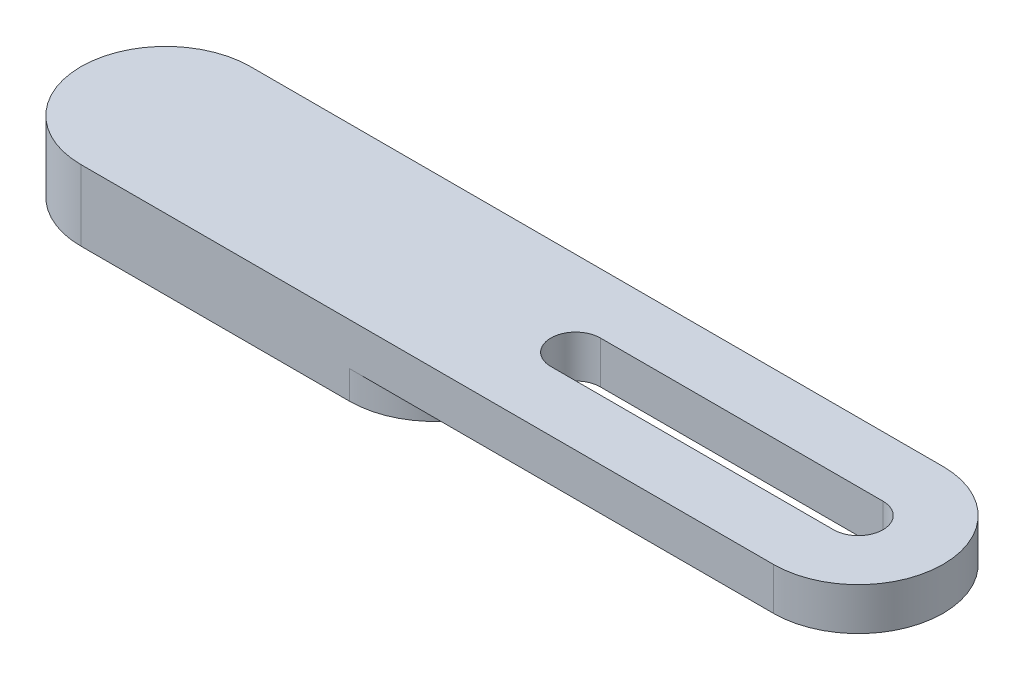
ISO-10303-21;
HEADER;
FILE_DESCRIPTION(('STEP AP214'),'2;1');
FILE_NAME('part.step','',(''),(''),'','','');
FILE_SCHEMA(('AUTOMOTIVE_DESIGN { 1 0 10303 214 1 1 1 1 }'));
ENDSEC;
DATA;
#1=APPLICATION_CONTEXT('core data for automotive mechanical design processes');
#2=APPLICATION_PROTOCOL_DEFINITION('international standard','automotive_design',2000,#1);
#3=PRODUCT_CONTEXT('',#1,'mechanical');
#4=PRODUCT('Part','Part','',(#3));
#5=PRODUCT_RELATED_PRODUCT_CATEGORY('part','',(#4));
#6=PRODUCT_DEFINITION_FORMATION('','',#4);
#7=PRODUCT_DEFINITION_CONTEXT('part definition',#1,'design');
#8=PRODUCT_DEFINITION('design','',#6,#7);
#9=PRODUCT_DEFINITION_SHAPE('','',#8);
#10=(LENGTH_UNIT() NAMED_UNIT(*) SI_UNIT(.MILLI.,.METRE.));
#11=(NAMED_UNIT(*) PLANE_ANGLE_UNIT() SI_UNIT($,.RADIAN.));
#12=(NAMED_UNIT(*) SI_UNIT($,.STERADIAN.) SOLID_ANGLE_UNIT());
#13=UNCERTAINTY_MEASURE_WITH_UNIT(LENGTH_MEASURE(1.E-05),#10,'distance_accuracy_value','');
#14=(GEOMETRIC_REPRESENTATION_CONTEXT(3) GLOBAL_UNCERTAINTY_ASSIGNED_CONTEXT((#13)) GLOBAL_UNIT_ASSIGNED_CONTEXT((#10,
#11,#12)) REPRESENTATION_CONTEXT('',''));
#15=CARTESIAN_POINT('',(0.,0.,0.));
#16=DIRECTION('',(0.,0.,1.));
#17=DIRECTION('',(1.,0.,0.));
#18=AXIS2_PLACEMENT_3D('',#15,#16,#17);
#19=CARTESIAN_POINT('',(19.,-3.,0.));
#20=DIRECTION('',(0.,1.,0.));
#21=DIRECTION('',(0.,0.,1.));
#22=AXIS2_PLACEMENT_3D('',#19,#20,#21);
#23=CYLINDRICAL_SURFACE('',#22,6.);
#24=DIRECTION('',(0.,1.,0.));
#25=VECTOR('',#24,1.);
#26=CARTESIAN_POINT('',(19.,-3.,-6.));
#27=LINE('',#26,#25);
#28=CARTESIAN_POINT('',(19.,-3.,-6.));
#29=VERTEX_POINT('',#28);
#30=CARTESIAN_POINT('',(19.,-1.,-6.));
#31=VERTEX_POINT('',#30);
#32=EDGE_CURVE('E144',#29,#31,#27,.T.);
#33=ORIENTED_EDGE('',*,*,#32,.T.);
#34=CARTESIAN_POINT('',(19.,-1.,0.));
#35=DIRECTION('',(0.,1.,0.));
#36=DIRECTION('',(0.,0.,1.));
#37=AXIS2_PLACEMENT_3D('',#34,#35,#36);
#38=CIRCLE('',#37,6.);
#39=CARTESIAN_POINT('',(19.,-1.,6.));
#40=VERTEX_POINT('',#39);
#41=EDGE_CURVE('E502',#40,#31,#38,.T.);
#42=ORIENTED_EDGE('',*,*,#41,.F.);
#43=DIRECTION('',(0.,1.,0.));
#44=VECTOR('',#43,1.);
#45=CARTESIAN_POINT('',(19.,-3.,6.));
#46=LINE('',#45,#44);
#47=CARTESIAN_POINT('',(19.,-3.,6.));
#48=VERTEX_POINT('',#47);
#49=EDGE_CURVE('E47',#48,#40,#46,.T.);
#50=ORIENTED_EDGE('',*,*,#49,.F.);
#51=CARTESIAN_POINT('',(19.,-3.,0.));
#52=DIRECTION('',(0.,1.,0.));
#53=DIRECTION('',(0.,0.,1.));
#54=AXIS2_PLACEMENT_3D('',#51,#52,#53);
#55=CIRCLE('',#54,6.);
#56=EDGE_CURVE('E545',#48,#29,#55,.T.);
#57=ORIENTED_EDGE('',*,*,#56,.T.);
#58=EDGE_LOOP('',(#33,#42,#50,#57));
#59=FACE_BOUND('',#58,.T.);
#60=ADVANCED_FACE('F43',(#59),#23,.T.);
#61=CARTESIAN_POINT('',(19.,-3.,0.));
#62=DIRECTION('',(0.,1.,0.));
#63=DIRECTION('',(0.,0.,1.));
#64=AXIS2_PLACEMENT_3D('',#61,#62,#63);
#65=CYLINDRICAL_SURFACE('',#64,2.5);
#66=CARTESIAN_POINT('',(19.,0.,0.));
#67=DIRECTION('',(0.,1.,0.));
#68=DIRECTION('',(0.,0.,1.));
#69=AXIS2_PLACEMENT_3D('',#66,#67,#68);
#70=CIRCLE('',#69,2.5);
#71=CARTESIAN_POINT('',(19.1973684210526,0.,2.49219696379945));
#72=VERTEX_POINT('',#71);
#73=CARTESIAN_POINT('',(19.1973684210526,0.,-2.49219696379945));
#74=VERTEX_POINT('',#73);
#75=EDGE_CURVE('E126',#72,#74,#70,.T.);
#76=ORIENTED_EDGE('',*,*,#75,.T.);
#77=DIRECTION('',(0.,1.,0.));
#78=VECTOR('',#77,1.);
#79=CARTESIAN_POINT('',(19.1973684210526,-3.,-2.49219696379945));
#80=LINE('',#79,#78);
#81=CARTESIAN_POINT('',(19.1973684210526,-3.,-2.49219696379945));
#82=VERTEX_POINT('',#81);
#83=EDGE_CURVE('E11',#82,#74,#80,.T.);
#84=ORIENTED_EDGE('',*,*,#83,.F.);
#85=CARTESIAN_POINT('',(19.,-3.,0.));
#86=DIRECTION('',(0.,1.,0.));
#87=DIRECTION('',(0.,0.,1.));
#88=AXIS2_PLACEMENT_3D('',#85,#86,#87);
#89=CIRCLE('',#88,2.5);
#90=CARTESIAN_POINT('',(19.1973684210526,-3.,2.49219696379945));
#91=VERTEX_POINT('',#90);
#92=EDGE_CURVE('E62',#91,#82,#89,.T.);
#93=ORIENTED_EDGE('',*,*,#92,.F.);
#94=DIRECTION('',(0.,1.,0.));
#95=VECTOR('',#94,1.);
#96=CARTESIAN_POINT('',(19.1973684210526,-3.,2.49219696379945));
#97=LINE('',#96,#95);
#98=EDGE_CURVE('E117',#91,#72,#97,.T.);
#99=ORIENTED_EDGE('',*,*,#98,.T.);
#100=EDGE_LOOP('',(#76,#84,#93,#99));
#101=FACE_BOUND('',#100,.T.);
#102=ADVANCED_FACE('F193',(#101),#65,.F.);
#103=CARTESIAN_POINT('',(0.31578947368421,-3.,-3.98751514207912));
#104=DIRECTION('',(-0.0789473684210526,0.,0.996878785519779));
#105=DIRECTION('',(0.99687878551978,0.,0.0789473684210526));
#106=AXIS2_PLACEMENT_3D('',#103,#104,#105);
#107=PLANE('',#106);
#108=DIRECTION('',(0.99687878551978,0.,0.0789473684210526));
#109=VECTOR('',#108,1.);
#110=CARTESIAN_POINT('',(0.31578947368421,0.,-3.98751514207912));
#111=LINE('',#110,#109);
#112=CARTESIAN_POINT('',(0.31578947368421,0.,-3.98751514207912));
#113=VERTEX_POINT('',#112);
#114=EDGE_CURVE('E133',#113,#74,#111,.T.);
#115=ORIENTED_EDGE('',*,*,#114,.F.);
#116=DIRECTION('',(0.,1.,0.));
#117=VECTOR('',#116,1.);
#118=CARTESIAN_POINT('',(0.31578947368421,-3.,-3.98751514207912));
#119=LINE('',#118,#117);
#120=CARTESIAN_POINT('',(0.31578947368421,-3.,-3.98751514207912));
#121=VERTEX_POINT('',#120);
#122=EDGE_CURVE('E53',#121,#113,#119,.T.);
#123=ORIENTED_EDGE('',*,*,#122,.F.);
#124=DIRECTION('',(0.99687878551978,0.,0.0789473684210526));
#125=VECTOR('',#124,1.);
#126=CARTESIAN_POINT('',(0.31578947368421,-3.,-3.98751514207912));
#127=LINE('',#126,#125);
#128=EDGE_CURVE('E111',#121,#82,#127,.T.);
#129=ORIENTED_EDGE('',*,*,#128,.T.);
#130=ORIENTED_EDGE('',*,*,#83,.T.);
#131=EDGE_LOOP('',(#115,#123,#129,#130));
#132=FACE_BOUND('',#131,.T.);
#133=ADVANCED_FACE('F196',(#132),#107,.T.);
#134=CARTESIAN_POINT('',(0.,-3.,0.));
#135=DIRECTION('',(0.,1.,0.));
#136=DIRECTION('',(0.,0.,1.));
#137=AXIS2_PLACEMENT_3D('',#134,#135,#136);
#138=CYLINDRICAL_SURFACE('',#137,4.);
#139=CARTESIAN_POINT('',(0.,0.,0.));
#140=DIRECTION('',(0.,1.,0.));
#141=DIRECTION('',(0.,0.,1.));
#142=AXIS2_PLACEMENT_3D('',#139,#140,#141);
#143=CIRCLE('',#142,4.);
#144=CARTESIAN_POINT('',(0.31578947368421,0.,3.98751514207912));
#145=VERTEX_POINT('',#144);
#146=EDGE_CURVE('E115',#113,#145,#143,.T.);
#147=ORIENTED_EDGE('',*,*,#146,.T.);
#148=DIRECTION('',(0.,1.,0.));
#149=VECTOR('',#148,1.);
#150=CARTESIAN_POINT('',(0.31578947368421,-3.,3.98751514207912));
#151=LINE('',#150,#149);
#152=CARTESIAN_POINT('',(0.31578947368421,-3.,3.98751514207912));
#153=VERTEX_POINT('',#152);
#154=EDGE_CURVE('E78',#153,#145,#151,.T.);
#155=ORIENTED_EDGE('',*,*,#154,.F.);
#156=CARTESIAN_POINT('',(0.,-3.,0.));
#157=DIRECTION('',(0.,1.,0.));
#158=DIRECTION('',(0.,0.,1.));
#159=AXIS2_PLACEMENT_3D('',#156,#157,#158);
#160=CIRCLE('',#159,4.);
#161=EDGE_CURVE('E107',#121,#153,#160,.T.);
#162=ORIENTED_EDGE('',*,*,#161,.F.);
#163=ORIENTED_EDGE('',*,*,#122,.T.);
#164=EDGE_LOOP('',(#147,#155,#162,#163));
#165=FACE_BOUND('',#164,.T.);
#166=ADVANCED_FACE('F113',(#165),#138,.F.);
#167=CARTESIAN_POINT('',(0.,-3.,6.));
#168=DIRECTION('',(0.,0.,1.));
#169=DIRECTION('',(1.,0.,0.));
#170=AXIS2_PLACEMENT_3D('',#167,#168,#169);
#171=PLANE('',#170);
#172=ORIENTED_EDGE('',*,*,#49,.T.);
#173=DIRECTION('',(-1.,0.,0.));
#174=VECTOR('',#173,1.);
#175=CARTESIAN_POINT('',(0.,-1.,6.));
#176=LINE('',#175,#174);
#177=CARTESIAN_POINT('',(49.,-1.,6.));
#178=VERTEX_POINT('',#177);
#179=EDGE_CURVE('E154',#178,#40,#176,.T.);
#180=ORIENTED_EDGE('',*,*,#179,.F.);
#181=DIRECTION('',(0.,1.,0.));
#182=VECTOR('',#181,1.);
#183=CARTESIAN_POINT('',(49.,-1.,6.));
#184=LINE('',#183,#182);
#185=CARTESIAN_POINT('',(49.,2.,6.));
#186=VERTEX_POINT('',#185);
#187=EDGE_CURVE('E525',#178,#186,#184,.T.);
#188=ORIENTED_EDGE('',*,*,#187,.T.);
#189=DIRECTION('',(1.,0.,0.));
#190=VECTOR('',#189,1.);
#191=CARTESIAN_POINT('',(0.,2.,6.));
#192=LINE('',#191,#190);
#193=CARTESIAN_POINT('',(0.,2.,6.));
#194=VERTEX_POINT('',#193);
#195=EDGE_CURVE('E527',#194,#186,#192,.T.);
#196=ORIENTED_EDGE('',*,*,#195,.F.);
#197=DIRECTION('',(0.,1.,0.));
#198=VECTOR('',#197,1.);
#199=CARTESIAN_POINT('',(0.,-3.,6.));
#200=LINE('',#199,#198);
#201=CARTESIAN_POINT('',(0.,-3.,6.));
#202=VERTEX_POINT('',#201);
#203=EDGE_CURVE('E139',#202,#194,#200,.T.);
#204=ORIENTED_EDGE('',*,*,#203,.F.);
#205=DIRECTION('',(1.,0.,0.));
#206=VECTOR('',#205,1.);
#207=CARTESIAN_POINT('',(0.,-3.,6.));
#208=LINE('',#207,#206);
#209=EDGE_CURVE('E135',#202,#48,#208,.T.);
#210=ORIENTED_EDGE('',*,*,#209,.T.);
#211=EDGE_LOOP('',(#172,#180,#188,#196,#204,#210));
#212=FACE_BOUND('',#211,.T.);
#213=ADVANCED_FACE('F45',(#212),#171,.T.);
#214=CARTESIAN_POINT('',(0.,-3.,0.));
#215=DIRECTION('',(0.,1.,0.));
#216=DIRECTION('',(0.,0.,1.));
#217=AXIS2_PLACEMENT_3D('',#214,#215,#216);
#218=CYLINDRICAL_SURFACE('',#217,6.);
#219=ORIENTED_EDGE('',*,*,#203,.T.);
#220=CARTESIAN_POINT('',(0.,2.,0.));
#221=DIRECTION('',(0.,1.,0.));
#222=DIRECTION('',(0.,0.,1.));
#223=AXIS2_PLACEMENT_3D('',#220,#221,#222);
#224=CIRCLE('',#223,6.);
#225=CARTESIAN_POINT('',(0.,2.,-6.));
#226=VERTEX_POINT('',#225);
#227=EDGE_CURVE('E130',#226,#194,#224,.T.);
#228=ORIENTED_EDGE('',*,*,#227,.F.);
#229=DIRECTION('',(0.,1.,0.));
#230=VECTOR('',#229,1.);
#231=CARTESIAN_POINT('',(0.,-3.,-6.));
#232=LINE('',#231,#230);
#233=CARTESIAN_POINT('',(0.,-3.,-6.));
#234=VERTEX_POINT('',#233);
#235=EDGE_CURVE('E142',#234,#226,#232,.T.);
#236=ORIENTED_EDGE('',*,*,#235,.F.);
#237=CARTESIAN_POINT('',(0.,-3.,0.));
#238=DIRECTION('',(0.,1.,0.));
#239=DIRECTION('',(0.,0.,1.));
#240=AXIS2_PLACEMENT_3D('',#237,#238,#239);
#241=CIRCLE('',#240,6.);
#242=EDGE_CURVE('E121',#234,#202,#241,.T.);
#243=ORIENTED_EDGE('',*,*,#242,.T.);
#244=EDGE_LOOP('',(#219,#228,#236,#243));
#245=FACE_BOUND('',#244,.T.);
#246=ADVANCED_FACE('F222',(#245),#218,.T.);
#247=CARTESIAN_POINT('',(0.,-3.,-6.));
#248=DIRECTION('',(0.,0.,-1.));
#249=DIRECTION('',(-1.,0.,0.));
#250=AXIS2_PLACEMENT_3D('',#247,#248,#249);
#251=PLANE('',#250);
#252=ORIENTED_EDGE('',*,*,#235,.T.);
#253=DIRECTION('',(-1.,0.,0.));
#254=VECTOR('',#253,1.);
#255=CARTESIAN_POINT('',(0.,2.,-6.));
#256=LINE('',#255,#254);
#257=CARTESIAN_POINT('',(49.,2.,-6.));
#258=VERTEX_POINT('',#257);
#259=EDGE_CURVE('E540',#258,#226,#256,.T.);
#260=ORIENTED_EDGE('',*,*,#259,.F.);
#261=DIRECTION('',(0.,1.,0.));
#262=VECTOR('',#261,1.);
#263=CARTESIAN_POINT('',(49.,-1.,-6.));
#264=LINE('',#263,#262);
#265=CARTESIAN_POINT('',(49.,-1.,-6.));
#266=VERTEX_POINT('',#265);
#267=EDGE_CURVE('E528',#266,#258,#264,.T.);
#268=ORIENTED_EDGE('',*,*,#267,.F.);
#269=DIRECTION('',(-1.,0.,0.));
#270=VECTOR('',#269,1.);
#271=CARTESIAN_POINT('',(0.,-1.,-6.));
#272=LINE('',#271,#270);
#273=EDGE_CURVE('E498',#266,#31,#272,.T.);
#274=ORIENTED_EDGE('',*,*,#273,.T.);
#275=ORIENTED_EDGE('',*,*,#32,.F.);
#276=DIRECTION('',(-1.,0.,0.));
#277=VECTOR('',#276,1.);
#278=CARTESIAN_POINT('',(0.,-3.,-6.));
#279=LINE('',#278,#277);
#280=EDGE_CURVE('E547',#29,#234,#279,.T.);
#281=ORIENTED_EDGE('',*,*,#280,.T.);
#282=EDGE_LOOP('',(#252,#260,#268,#274,#275,#281));
#283=FACE_BOUND('',#282,.T.);
#284=ADVANCED_FACE('F219',(#283),#251,.T.);
#285=CARTESIAN_POINT('',(0.31578947368421,-3.,3.98751514207912));
#286=DIRECTION('',(-0.0789473684210526,0.,-0.996878785519779));
#287=DIRECTION('',(-0.99687878551978,0.,0.0789473684210526));
#288=AXIS2_PLACEMENT_3D('',#285,#286,#287);
#289=PLANE('',#288);
#290=DIRECTION('',(-0.99687878551978,0.,0.0789473684210526));
#291=VECTOR('',#290,1.);
#292=CARTESIAN_POINT('',(0.31578947368421,0.,3.98751514207912));
#293=LINE('',#292,#291);
#294=EDGE_CURVE('E129',#72,#145,#293,.T.);
#295=ORIENTED_EDGE('',*,*,#294,.F.);
#296=ORIENTED_EDGE('',*,*,#98,.F.);
#297=DIRECTION('',(-0.99687878551978,0.,0.0789473684210526));
#298=VECTOR('',#297,1.);
#299=CARTESIAN_POINT('',(0.31578947368421,-3.,3.98751514207912));
#300=LINE('',#299,#298);
#301=EDGE_CURVE('E109',#91,#153,#300,.T.);
#302=ORIENTED_EDGE('',*,*,#301,.T.);
#303=ORIENTED_EDGE('',*,*,#154,.T.);
#304=EDGE_LOOP('',(#295,#296,#302,#303));
#305=FACE_BOUND('',#304,.T.);
#306=ADVANCED_FACE('F119',(#305),#289,.T.);
#307=CARTESIAN_POINT('',(0.,-3.,0.));
#308=DIRECTION('',(0.,1.,0.));
#309=DIRECTION('',(0.,0.,1.));
#310=AXIS2_PLACEMENT_3D('',#307,#308,#309);
#311=PLANE('',#310);
#312=ORIENTED_EDGE('',*,*,#209,.F.);
#313=ORIENTED_EDGE('',*,*,#242,.F.);
#314=ORIENTED_EDGE('',*,*,#280,.F.);
#315=ORIENTED_EDGE('',*,*,#56,.F.);
#316=EDGE_LOOP('',(#312,#313,#314,#315));
#317=FACE_BOUND('',#316,.T.);
#318=ORIENTED_EDGE('',*,*,#92,.T.);
#319=ORIENTED_EDGE('',*,*,#128,.F.);
#320=ORIENTED_EDGE('',*,*,#161,.T.);
#321=ORIENTED_EDGE('',*,*,#301,.F.);
#322=EDGE_LOOP('',(#318,#319,#320,#321));
#323=FACE_BOUND('',#322,.T.);
#324=ADVANCED_FACE('F108',(#317,#323),#311,.F.);
#325=CARTESIAN_POINT('',(0.,0.,0.));
#326=DIRECTION('',(0.,1.,0.));
#327=DIRECTION('',(0.,0.,1.));
#328=AXIS2_PLACEMENT_3D('',#325,#326,#327);
#329=PLANE('',#328);
#330=ORIENTED_EDGE('',*,*,#75,.F.);
#331=ORIENTED_EDGE('',*,*,#294,.T.);
#332=ORIENTED_EDGE('',*,*,#146,.F.);
#333=ORIENTED_EDGE('',*,*,#114,.T.);
#334=EDGE_LOOP('',(#330,#331,#332,#333));
#335=FACE_BOUND('',#334,.T.);
#336=ADVANCED_FACE('F197',(#335),#329,.F.);
#337=CARTESIAN_POINT('',(0.,2.,0.));
#338=DIRECTION('',(0.,1.,0.));
#339=DIRECTION('',(0.,0.,1.));
#340=AXIS2_PLACEMENT_3D('',#337,#338,#339);
#341=PLANE('',#340);
#342=ORIENTED_EDGE('',*,*,#195,.T.);
#343=CARTESIAN_POINT('',(49.,2.,0.));
#344=DIRECTION('',(0.,1.,0.));
#345=DIRECTION('',(0.,0.,1.));
#346=AXIS2_PLACEMENT_3D('',#343,#344,#345);
#347=CIRCLE('',#346,6.);
#348=EDGE_CURVE('E522',#186,#258,#347,.T.);
#349=ORIENTED_EDGE('',*,*,#348,.T.);
#350=ORIENTED_EDGE('',*,*,#259,.T.);
#351=ORIENTED_EDGE('',*,*,#227,.T.);
#352=EDGE_LOOP('',(#342,#349,#350,#351));
#353=FACE_BOUND('',#352,.T.);
#354=DIRECTION('',(-1.,0.,0.));
#355=VECTOR('',#354,1.);
#356=CARTESIAN_POINT('',(0.,2.,-1.74999999999999));
#357=LINE('',#356,#355);
#358=CARTESIAN_POINT('',(49.,2.,-1.75));
#359=VERTEX_POINT('',#358);
#360=CARTESIAN_POINT('',(29.,2.,-1.75));
#361=VERTEX_POINT('',#360);
#362=EDGE_CURVE('E511',#359,#361,#357,.T.);
#363=ORIENTED_EDGE('',*,*,#362,.F.);
#364=CARTESIAN_POINT('',(49.,2.,0.));
#365=DIRECTION('',(0.,1.,0.));
#366=DIRECTION('',(0.,0.,1.));
#367=AXIS2_PLACEMENT_3D('',#364,#365,#366);
#368=CIRCLE('',#367,1.75);
#369=CARTESIAN_POINT('',(49.,2.,1.75));
#370=VERTEX_POINT('',#369);
#371=EDGE_CURVE('E514',#370,#359,#368,.T.);
#372=ORIENTED_EDGE('',*,*,#371,.F.);
#373=DIRECTION('',(-1.,0.,0.));
#374=VECTOR('',#373,1.);
#375=CARTESIAN_POINT('',(0.,2.,1.75000000000001));
#376=LINE('',#375,#374);
#377=CARTESIAN_POINT('',(29.,2.,1.75));
#378=VERTEX_POINT('',#377);
#379=EDGE_CURVE('E516',#370,#378,#376,.T.);
#380=ORIENTED_EDGE('',*,*,#379,.T.);
#381=CARTESIAN_POINT('',(29.,2.,0.));
#382=DIRECTION('',(0.,1.,0.));
#383=DIRECTION('',(0.,0.,1.));
#384=AXIS2_PLACEMENT_3D('',#381,#382,#383);
#385=CIRCLE('',#384,1.75);
#386=EDGE_CURVE('E519',#361,#378,#385,.T.);
#387=ORIENTED_EDGE('',*,*,#386,.F.);
#388=EDGE_LOOP('',(#363,#372,#380,#387));
#389=FACE_BOUND('',#388,.T.);
#390=ADVANCED_FACE('F199',(#353,#389),#341,.T.);
#391=CARTESIAN_POINT('',(49.,-1.,0.));
#392=DIRECTION('',(0.,1.,0.));
#393=DIRECTION('',(0.,0.,1.));
#394=AXIS2_PLACEMENT_3D('',#391,#392,#393);
#395=CYLINDRICAL_SURFACE('',#394,6.);
#396=ORIENTED_EDGE('',*,*,#348,.F.);
#397=ORIENTED_EDGE('',*,*,#187,.F.);
#398=CARTESIAN_POINT('',(49.,-1.,0.));
#399=DIRECTION('',(0.,1.,0.));
#400=DIRECTION('',(0.,0.,1.));
#401=AXIS2_PLACEMENT_3D('',#398,#399,#400);
#402=CIRCLE('',#401,6.);
#403=EDGE_CURVE('E496',#178,#266,#402,.T.);
#404=ORIENTED_EDGE('',*,*,#403,.T.);
#405=ORIENTED_EDGE('',*,*,#267,.T.);
#406=EDGE_LOOP('',(#396,#397,#404,#405));
#407=FACE_BOUND('',#406,.T.);
#408=ADVANCED_FACE('F206',(#407),#395,.T.);
#409=CARTESIAN_POINT('',(0.,-1.,-1.74999999999999));
#410=DIRECTION('',(0.,0.,-1.));
#411=DIRECTION('',(-1.,0.,0.));
#412=AXIS2_PLACEMENT_3D('',#409,#410,#411);
#413=PLANE('',#412);
#414=ORIENTED_EDGE('',*,*,#362,.T.);
#415=DIRECTION('',(0.,1.,0.));
#416=VECTOR('',#415,1.);
#417=CARTESIAN_POINT('',(29.,-1.,-1.75));
#418=LINE('',#417,#416);
#419=CARTESIAN_POINT('',(29.,-1.,-1.75));
#420=VERTEX_POINT('',#419);
#421=EDGE_CURVE('E530',#420,#361,#418,.T.);
#422=ORIENTED_EDGE('',*,*,#421,.F.);
#423=DIRECTION('',(-1.,0.,0.));
#424=VECTOR('',#423,1.);
#425=CARTESIAN_POINT('',(0.,-1.,-1.74999999999999));
#426=LINE('',#425,#424);
#427=CARTESIAN_POINT('',(49.,-1.,-1.75));
#428=VERTEX_POINT('',#427);
#429=EDGE_CURVE('E492',#428,#420,#426,.T.);
#430=ORIENTED_EDGE('',*,*,#429,.F.);
#431=DIRECTION('',(0.,1.,0.));
#432=VECTOR('',#431,1.);
#433=CARTESIAN_POINT('',(49.,-1.,-1.75));
#434=LINE('',#433,#432);
#435=EDGE_CURVE('E510',#428,#359,#434,.T.);
#436=ORIENTED_EDGE('',*,*,#435,.T.);
#437=EDGE_LOOP('',(#414,#422,#430,#436));
#438=FACE_BOUND('',#437,.T.);
#439=ADVANCED_FACE('F290',(#438),#413,.F.);
#440=CARTESIAN_POINT('',(29.,-1.,0.));
#441=DIRECTION('',(0.,1.,0.));
#442=DIRECTION('',(0.,0.,1.));
#443=AXIS2_PLACEMENT_3D('',#440,#441,#442);
#444=CYLINDRICAL_SURFACE('',#443,1.75);
#445=ORIENTED_EDGE('',*,*,#386,.T.);
#446=DIRECTION('',(0.,1.,0.));
#447=VECTOR('',#446,1.);
#448=CARTESIAN_POINT('',(29.,-1.,1.75));
#449=LINE('',#448,#447);
#450=CARTESIAN_POINT('',(29.,-1.,1.75));
#451=VERTEX_POINT('',#450);
#452=EDGE_CURVE('E533',#451,#378,#449,.T.);
#453=ORIENTED_EDGE('',*,*,#452,.F.);
#454=CARTESIAN_POINT('',(29.,-1.,0.));
#455=DIRECTION('',(0.,1.,0.));
#456=DIRECTION('',(0.,0.,1.));
#457=AXIS2_PLACEMENT_3D('',#454,#455,#456);
#458=CIRCLE('',#457,1.75);
#459=EDGE_CURVE('E500',#420,#451,#458,.T.);
#460=ORIENTED_EDGE('',*,*,#459,.F.);
#461=ORIENTED_EDGE('',*,*,#421,.T.);
#462=EDGE_LOOP('',(#445,#453,#460,#461));
#463=FACE_BOUND('',#462,.T.);
#464=ADVANCED_FACE('F300',(#463),#444,.F.);
#465=CARTESIAN_POINT('',(0.,-1.,1.75000000000001));
#466=DIRECTION('',(0.,0.,-1.));
#467=DIRECTION('',(-1.,0.,0.));
#468=AXIS2_PLACEMENT_3D('',#465,#466,#467);
#469=PLANE('',#468);
#470=ORIENTED_EDGE('',*,*,#379,.F.);
#471=DIRECTION('',(0.,1.,0.));
#472=VECTOR('',#471,1.);
#473=CARTESIAN_POINT('',(49.,-1.,1.75));
#474=LINE('',#473,#472);
#475=CARTESIAN_POINT('',(49.,-1.,1.75));
#476=VERTEX_POINT('',#475);
#477=EDGE_CURVE('E535',#476,#370,#474,.T.);
#478=ORIENTED_EDGE('',*,*,#477,.F.);
#479=DIRECTION('',(-1.,0.,0.));
#480=VECTOR('',#479,1.);
#481=CARTESIAN_POINT('',(0.,-1.,1.75000000000001));
#482=LINE('',#481,#480);
#483=EDGE_CURVE('E504',#476,#451,#482,.T.);
#484=ORIENTED_EDGE('',*,*,#483,.T.);
#485=ORIENTED_EDGE('',*,*,#452,.T.);
#486=EDGE_LOOP('',(#470,#478,#484,#485));
#487=FACE_BOUND('',#486,.T.);
#488=ADVANCED_FACE('F310',(#487),#469,.T.);
#489=CARTESIAN_POINT('',(49.,-1.,0.));
#490=DIRECTION('',(0.,1.,0.));
#491=DIRECTION('',(0.,0.,1.));
#492=AXIS2_PLACEMENT_3D('',#489,#490,#491);
#493=CYLINDRICAL_SURFACE('',#492,1.75);
#494=ORIENTED_EDGE('',*,*,#371,.T.);
#495=ORIENTED_EDGE('',*,*,#435,.F.);
#496=CARTESIAN_POINT('',(49.,-1.,0.));
#497=DIRECTION('',(0.,1.,0.));
#498=DIRECTION('',(0.,0.,1.));
#499=AXIS2_PLACEMENT_3D('',#496,#497,#498);
#500=CIRCLE('',#499,1.75);
#501=EDGE_CURVE('E561',#476,#428,#500,.T.);
#502=ORIENTED_EDGE('',*,*,#501,.F.);
#503=ORIENTED_EDGE('',*,*,#477,.T.);
#504=EDGE_LOOP('',(#494,#495,#502,#503));
#505=FACE_BOUND('',#504,.T.);
#506=ADVANCED_FACE('F320',(#505),#493,.F.);
#507=CARTESIAN_POINT('',(0.,-1.,0.));
#508=DIRECTION('',(0.,1.,0.));
#509=DIRECTION('',(0.,0.,1.));
#510=AXIS2_PLACEMENT_3D('',#507,#508,#509);
#511=PLANE('',#510);
#512=ORIENTED_EDGE('',*,*,#429,.T.);
#513=ORIENTED_EDGE('',*,*,#459,.T.);
#514=ORIENTED_EDGE('',*,*,#483,.F.);
#515=ORIENTED_EDGE('',*,*,#501,.T.);
#516=EDGE_LOOP('',(#512,#513,#514,#515));
#517=FACE_BOUND('',#516,.T.);
#518=ORIENTED_EDGE('',*,*,#403,.F.);
#519=ORIENTED_EDGE('',*,*,#179,.T.);
#520=ORIENTED_EDGE('',*,*,#41,.T.);
#521=ORIENTED_EDGE('',*,*,#273,.F.);
#522=EDGE_LOOP('',(#518,#519,#520,#521));
#523=FACE_BOUND('',#522,.T.);
#524=ADVANCED_FACE('F330',(#517,#523),#511,.F.);
#525=CLOSED_SHELL('',(#60,#102,#133,#166,#213,#246,#284,#306,#324,#336,#390,#408,#439,#464,#488,
#506,#524));
#526=MANIFOLD_SOLID_BREP('B2',#525);
#527=ADVANCED_BREP_SHAPE_REPRESENTATION('',(#18,#526),#14);
#528=SHAPE_DEFINITION_REPRESENTATION(#9,#527);
ENDSEC;
END-ISO-10303-21;
